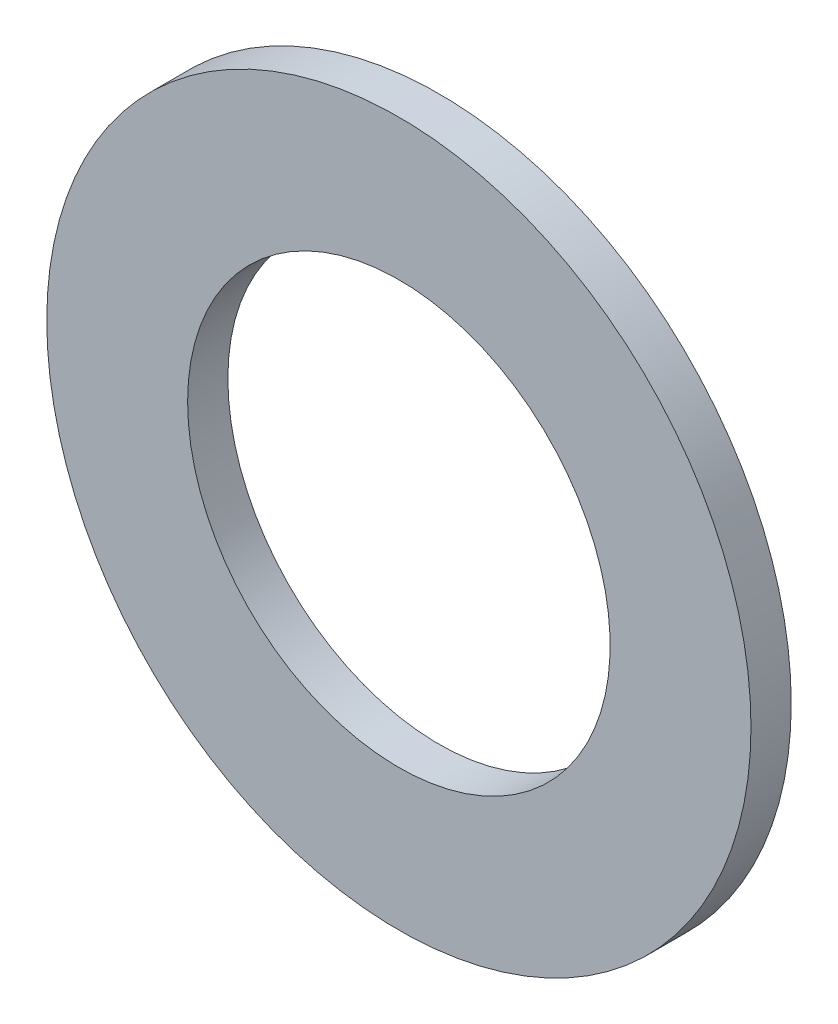
ISO-10303-21;
HEADER;
FILE_DESCRIPTION(('STEP AP214'),'2;1');
FILE_NAME('part.step','',(''),(''),'','','');
FILE_SCHEMA(('AUTOMOTIVE_DESIGN { 1 0 10303 214 1 1 1 1 }'));
ENDSEC;
DATA;
#1=APPLICATION_CONTEXT('core data for automotive mechanical design processes');
#2=APPLICATION_PROTOCOL_DEFINITION('international standard','automotive_design',2000,#1);
#3=PRODUCT_CONTEXT('',#1,'mechanical');
#4=PRODUCT('Part','Part','',(#3));
#5=PRODUCT_RELATED_PRODUCT_CATEGORY('part','',(#4));
#6=PRODUCT_DEFINITION_FORMATION('','',#4);
#7=PRODUCT_DEFINITION_CONTEXT('part definition',#1,'design');
#8=PRODUCT_DEFINITION('design','',#6,#7);
#9=PRODUCT_DEFINITION_SHAPE('','',#8);
#10=(LENGTH_UNIT() NAMED_UNIT(*) SI_UNIT(.MILLI.,.METRE.));
#11=(NAMED_UNIT(*) PLANE_ANGLE_UNIT() SI_UNIT($,.RADIAN.));
#12=(NAMED_UNIT(*) SI_UNIT($,.STERADIAN.) SOLID_ANGLE_UNIT());
#13=UNCERTAINTY_MEASURE_WITH_UNIT(LENGTH_MEASURE(1.E-05),#10,'distance_accuracy_value','');
#14=(GEOMETRIC_REPRESENTATION_CONTEXT(3) GLOBAL_UNCERTAINTY_ASSIGNED_CONTEXT((#13)) GLOBAL_UNIT_ASSIGNED_CONTEXT((#10,
#11,#12)) REPRESENTATION_CONTEXT('',''));
#15=CARTESIAN_POINT('',(0.,0.,0.));
#16=DIRECTION('',(0.,0.,1.));
#17=DIRECTION('',(1.,0.,0.));
#18=AXIS2_PLACEMENT_3D('',#15,#16,#17);
#19=CARTESIAN_POINT('',(0.,0.,1.99999999999998));
#20=DIRECTION('',(0.,0.,0.999999999999995));
#21=DIRECTION('',(0.999999999999999,0.,0.));
#22=AXIS2_PLACEMENT_3D('',#19,#20,#21);
#23=PLANE('',#22);
#24=CARTESIAN_POINT('',(0.,0.,1.99999999999998));
#25=DIRECTION('',(0.,0.,0.999999999999995));
#26=DIRECTION('',(0.999999999999999,0.,0.));
#27=AXIS2_PLACEMENT_3D('',#24,#25,#26);
#28=CIRCLE('',#27,17.5);
#29=CARTESIAN_POINT('',(-17.5,0.,1.99999999999998));
#30=VERTEX_POINT('',#29);
#31=EDGE_CURVE('E12',#30,#30,#28,.T.);
#32=ORIENTED_EDGE('',*,*,#31,.T.);
#33=EDGE_LOOP('',(#32));
#34=FACE_BOUND('',#33,.T.);
#35=CARTESIAN_POINT('',(0.,0.,1.99999999999998));
#36=DIRECTION('',(0.,0.,0.999999999999995));
#37=DIRECTION('',(0.999999999999999,0.,0.));
#38=AXIS2_PLACEMENT_3D('',#35,#36,#37);
#39=CIRCLE('',#38,10.5);
#40=CARTESIAN_POINT('',(-10.5,0.,1.99999999999998));
#41=VERTEX_POINT('',#40);
#42=EDGE_CURVE('E49',#41,#41,#39,.T.);
#43=ORIENTED_EDGE('',*,*,#42,.F.);
#44=EDGE_LOOP('',(#43));
#45=FACE_BOUND('',#44,.T.);
#46=ADVANCED_FACE('F38',(#34,#45),#23,.T.);
#47=CARTESIAN_POINT('',(0.,0.,0.));
#48=DIRECTION('',(0.,0.,0.999999999999995));
#49=DIRECTION('',(0.999999999999999,0.,0.));
#50=AXIS2_PLACEMENT_3D('',#47,#48,#49);
#51=PLANE('',#50);
#52=CARTESIAN_POINT('',(0.,0.,0.));
#53=DIRECTION('',(0.,0.,0.999999999999995));
#54=DIRECTION('',(0.999999999999999,0.,0.));
#55=AXIS2_PLACEMENT_3D('',#52,#53,#54);
#56=CIRCLE('',#55,17.5);
#57=CARTESIAN_POINT('',(-17.5,0.,0.));
#58=VERTEX_POINT('',#57);
#59=EDGE_CURVE('E42',#58,#58,#56,.T.);
#60=ORIENTED_EDGE('',*,*,#59,.F.);
#61=EDGE_LOOP('',(#60));
#62=FACE_BOUND('',#61,.T.);
#63=CARTESIAN_POINT('',(0.,0.,0.));
#64=DIRECTION('',(0.,0.,0.999999999999995));
#65=DIRECTION('',(0.999999999999999,0.,0.));
#66=AXIS2_PLACEMENT_3D('',#63,#64,#65);
#67=CIRCLE('',#66,10.5);
#68=CARTESIAN_POINT('',(-10.5,0.,0.));
#69=VERTEX_POINT('',#68);
#70=EDGE_CURVE('E51',#69,#69,#67,.T.);
#71=ORIENTED_EDGE('',*,*,#70,.T.);
#72=EDGE_LOOP('',(#71));
#73=FACE_BOUND('',#72,.T.);
#74=ADVANCED_FACE('F61',(#62,#73),#51,.F.);
#75=CARTESIAN_POINT('',(0.,0.,1.99999999999998));
#76=DIRECTION('',(0.,0.,-0.999999999999995));
#77=DIRECTION('',(-0.999999999999999,0.,0.));
#78=AXIS2_PLACEMENT_3D('',#75,#76,#77);
#79=CYLINDRICAL_SURFACE('',#78,17.5);
#80=CARTESIAN_POINT('',(-17.5,0.,1.99999999999998));
#81=CARTESIAN_POINT('',(-17.5,0.,1.97916666666665));
#82=CARTESIAN_POINT('',(-17.5,0.,1.95833333333332));
#83=CARTESIAN_POINT('',(-17.5,0.,1.91666666666665));
#84=CARTESIAN_POINT('',(-17.5,0.,1.89583333333332));
#85=CARTESIAN_POINT('',(-17.5,0.,1.85416666666665));
#86=CARTESIAN_POINT('',(-17.5,0.,1.83333333333332));
#87=CARTESIAN_POINT('',(-17.5,0.,1.79166666666665));
#88=CARTESIAN_POINT('',(-17.5,0.,1.77083333333332));
#89=CARTESIAN_POINT('',(-17.5,0.,1.72916666666665));
#90=CARTESIAN_POINT('',(-17.5,0.,1.70833333333332));
#91=CARTESIAN_POINT('',(-17.5,0.,1.66666666666665));
#92=CARTESIAN_POINT('',(-17.5,0.,1.64583333333332));
#93=CARTESIAN_POINT('',(-17.5,0.,1.60416666666665));
#94=CARTESIAN_POINT('',(-17.5,0.,1.58333333333332));
#95=CARTESIAN_POINT('',(-17.5,0.,1.54166666666665));
#96=CARTESIAN_POINT('',(-17.5,0.,1.52083333333332));
#97=CARTESIAN_POINT('',(-17.5,0.,1.47916666666665));
#98=CARTESIAN_POINT('',(-17.5,0.,1.45833333333332));
#99=CARTESIAN_POINT('',(-17.5,0.,1.41666666666665));
#100=CARTESIAN_POINT('',(-17.5,0.,1.39583333333332));
#101=CARTESIAN_POINT('',(-17.5,0.,1.35416666666665));
#102=CARTESIAN_POINT('',(-17.5,0.,1.33333333333332));
#103=CARTESIAN_POINT('',(-17.5,0.,1.29166666666665));
#104=CARTESIAN_POINT('',(-17.5,0.,1.27083333333332));
#105=CARTESIAN_POINT('',(-17.5,0.,1.22916666666666));
#106=CARTESIAN_POINT('',(-17.5,0.,1.20833333333332));
#107=CARTESIAN_POINT('',(-17.5,0.,1.16666666666666));
#108=CARTESIAN_POINT('',(-17.5,0.,1.14583333333332));
#109=CARTESIAN_POINT('',(-17.5,0.,1.10416666666666));
#110=CARTESIAN_POINT('',(-17.5,0.,1.08333333333332));
#111=CARTESIAN_POINT('',(-17.5,0.,1.04166666666666));
#112=CARTESIAN_POINT('',(-17.5,0.,1.02083333333332));
#113=CARTESIAN_POINT('',(-17.5,0.,0.979166666666658));
#114=CARTESIAN_POINT('',(-17.5,0.,0.958333333333325));
#115=CARTESIAN_POINT('',(-17.5,0.,0.916666666666658));
#116=CARTESIAN_POINT('',(-17.5,0.,0.895833333333325));
#117=CARTESIAN_POINT('',(-17.5,0.,0.854166666666659));
#118=CARTESIAN_POINT('',(-17.5,0.,0.833333333333326));
#119=CARTESIAN_POINT('',(-17.5,0.,0.79166666666666));
#120=CARTESIAN_POINT('',(-17.5,0.,0.770833333333326));
#121=CARTESIAN_POINT('',(-17.5,0.,0.72916666666666));
#122=CARTESIAN_POINT('',(-17.5,0.,0.708333333333327));
#123=CARTESIAN_POINT('',(-17.5,0.,0.666666666666661));
#124=CARTESIAN_POINT('',(-17.5,0.,0.645833333333327));
#125=CARTESIAN_POINT('',(-17.5,0.,0.604166666666661));
#126=CARTESIAN_POINT('',(-17.5,0.,0.583333333333328));
#127=CARTESIAN_POINT('',(-17.5,0.,0.541666666666662));
#128=CARTESIAN_POINT('',(-17.5,0.,0.520833333333329));
#129=CARTESIAN_POINT('',(-17.5,0.,0.479166666666662));
#130=CARTESIAN_POINT('',(-17.5,0.,0.458333333333329));
#131=CARTESIAN_POINT('',(-17.5,0.,0.416666666666663));
#132=CARTESIAN_POINT('',(-17.5,0.,0.39583333333333));
#133=CARTESIAN_POINT('',(-17.5,0.,0.354166666666663));
#134=CARTESIAN_POINT('',(-17.5,0.,0.33333333333333));
#135=CARTESIAN_POINT('',(-17.5,0.,0.291666666666664));
#136=CARTESIAN_POINT('',(-17.5,0.,0.270833333333331));
#137=CARTESIAN_POINT('',(-17.5,0.,0.229166666666665));
#138=CARTESIAN_POINT('',(-17.5,0.,0.208333333333331));
#139=CARTESIAN_POINT('',(-17.5,0.,0.166666666666665));
#140=CARTESIAN_POINT('',(-17.5,0.,0.145833333333332));
#141=CARTESIAN_POINT('',(-17.5,0.,0.104166666666666));
#142=CARTESIAN_POINT('',(-17.5,0.,0.0833333333333325));
#143=CARTESIAN_POINT('',(-17.5,0.,0.0416666666666663));
#144=CARTESIAN_POINT('',(-17.5,0.,0.0208333333333331));
#145=CARTESIAN_POINT('',(-17.5,0.,0.));
#146=B_SPLINE_CURVE_WITH_KNOTS('',3,(#80,#81,#82,#83,#84,#85,#86,#87,#88,#89,#90,#91,#92,#93,
#94,#95,#96,#97,#98,#99,#100,#101,#102,#103,#104,#105,#106,#107,#108,#109,#110,#111,#112,#113,
#114,#115,#116,#117,#118,#119,#120,#121,#122,#123,#124,#125,#126,#127,#128,#129,#130,#131,#132,
#133,#134,#135,#136,#137,#138,#139,#140,#141,#142,#143,#144,#145),.UNSPECIFIED.,.F.,.F.,(4,2,2,
2,2,2,2,2,2,2,2,2,2,2,2,2,2,2,2,2,2,2,2,2,2,2,2,2,2,2,2,2,4),(0.,0.0624999999999992,
0.124999999999999,0.187499999999998,0.249999999999997,0.312499999999997,0.374999999999996,
0.437499999999996,0.499999999999995,0.562499999999995,0.624999999999994,0.687499999999993,
0.749999999999993,0.812499999999992,0.874999999999992,0.937499999999991,0.99999999999999,
1.06249999999999,1.12499999999999,1.18749999999999,1.24999999999999,1.31249999999999,
1.37499999999999,1.43749999999999,1.49999999999999,1.56249999999999,1.62499999999998,
1.68749999999998,1.74999999999998,1.81249999999998,1.87499999999998,1.93749999999998,
1.99999999999998),.UNSPECIFIED.);
#147=EDGE_CURVE('BSEAM40',#30,#58,#146,.T.);
#148=ORIENTED_EDGE('',*,*,#31,.F.);
#149=ORIENTED_EDGE('',*,*,#59,.T.);
#150=ORIENTED_EDGE('',*,*,#147,.T.);
#151=ORIENTED_EDGE('',*,*,#147,.F.);
#152=EDGE_LOOP('',(#148,#150,#149,#151));
#153=FACE_BOUND('',#152,.T.);
#154=ADVANCED_FACE('F40',(#153),#79,.T.);
#155=CARTESIAN_POINT('',(0.,0.,1.99999999999998));
#156=DIRECTION('',(0.,0.,-0.999999999999995));
#157=DIRECTION('',(-0.999999999999999,0.,0.));
#158=AXIS2_PLACEMENT_3D('',#155,#156,#157);
#159=CYLINDRICAL_SURFACE('',#158,10.5);
#160=CARTESIAN_POINT('',(-10.5,0.,1.99999999999998));
#161=CARTESIAN_POINT('',(-10.5,0.,1.97916666666665));
#162=CARTESIAN_POINT('',(-10.5,0.,1.95833333333332));
#163=CARTESIAN_POINT('',(-10.5,0.,1.91666666666665));
#164=CARTESIAN_POINT('',(-10.5,0.,1.89583333333332));
#165=CARTESIAN_POINT('',(-10.5,0.,1.85416666666665));
#166=CARTESIAN_POINT('',(-10.5,0.,1.83333333333332));
#167=CARTESIAN_POINT('',(-10.5,0.,1.79166666666665));
#168=CARTESIAN_POINT('',(-10.5,0.,1.77083333333332));
#169=CARTESIAN_POINT('',(-10.5,0.,1.72916666666665));
#170=CARTESIAN_POINT('',(-10.5,0.,1.70833333333332));
#171=CARTESIAN_POINT('',(-10.5,0.,1.66666666666665));
#172=CARTESIAN_POINT('',(-10.5,0.,1.64583333333332));
#173=CARTESIAN_POINT('',(-10.5,0.,1.60416666666665));
#174=CARTESIAN_POINT('',(-10.5,0.,1.58333333333332));
#175=CARTESIAN_POINT('',(-10.5,0.,1.54166666666665));
#176=CARTESIAN_POINT('',(-10.5,0.,1.52083333333332));
#177=CARTESIAN_POINT('',(-10.5,0.,1.47916666666665));
#178=CARTESIAN_POINT('',(-10.5,0.,1.45833333333332));
#179=CARTESIAN_POINT('',(-10.5,0.,1.41666666666665));
#180=CARTESIAN_POINT('',(-10.5,0.,1.39583333333332));
#181=CARTESIAN_POINT('',(-10.5,0.,1.35416666666665));
#182=CARTESIAN_POINT('',(-10.5,0.,1.33333333333332));
#183=CARTESIAN_POINT('',(-10.5,0.,1.29166666666665));
#184=CARTESIAN_POINT('',(-10.5,0.,1.27083333333332));
#185=CARTESIAN_POINT('',(-10.5,0.,1.22916666666666));
#186=CARTESIAN_POINT('',(-10.5,0.,1.20833333333332));
#187=CARTESIAN_POINT('',(-10.5,0.,1.16666666666666));
#188=CARTESIAN_POINT('',(-10.5,0.,1.14583333333332));
#189=CARTESIAN_POINT('',(-10.5,0.,1.10416666666666));
#190=CARTESIAN_POINT('',(-10.5,0.,1.08333333333332));
#191=CARTESIAN_POINT('',(-10.5,0.,1.04166666666666));
#192=CARTESIAN_POINT('',(-10.5,0.,1.02083333333332));
#193=CARTESIAN_POINT('',(-10.5,0.,0.979166666666658));
#194=CARTESIAN_POINT('',(-10.5,0.,0.958333333333325));
#195=CARTESIAN_POINT('',(-10.5,0.,0.916666666666658));
#196=CARTESIAN_POINT('',(-10.5,0.,0.895833333333325));
#197=CARTESIAN_POINT('',(-10.5,0.,0.854166666666659));
#198=CARTESIAN_POINT('',(-10.5,0.,0.833333333333326));
#199=CARTESIAN_POINT('',(-10.5,0.,0.79166666666666));
#200=CARTESIAN_POINT('',(-10.5,0.,0.770833333333326));
#201=CARTESIAN_POINT('',(-10.5,0.,0.72916666666666));
#202=CARTESIAN_POINT('',(-10.5,0.,0.708333333333327));
#203=CARTESIAN_POINT('',(-10.5,0.,0.666666666666661));
#204=CARTESIAN_POINT('',(-10.5,0.,0.645833333333327));
#205=CARTESIAN_POINT('',(-10.5,0.,0.604166666666661));
#206=CARTESIAN_POINT('',(-10.5,0.,0.583333333333328));
#207=CARTESIAN_POINT('',(-10.5,0.,0.541666666666662));
#208=CARTESIAN_POINT('',(-10.5,0.,0.520833333333329));
#209=CARTESIAN_POINT('',(-10.5,0.,0.479166666666662));
#210=CARTESIAN_POINT('',(-10.5,0.,0.458333333333329));
#211=CARTESIAN_POINT('',(-10.5,0.,0.416666666666663));
#212=CARTESIAN_POINT('',(-10.5,0.,0.39583333333333));
#213=CARTESIAN_POINT('',(-10.5,0.,0.354166666666663));
#214=CARTESIAN_POINT('',(-10.5,0.,0.33333333333333));
#215=CARTESIAN_POINT('',(-10.5,0.,0.291666666666664));
#216=CARTESIAN_POINT('',(-10.5,0.,0.270833333333331));
#217=CARTESIAN_POINT('',(-10.5,0.,0.229166666666665));
#218=CARTESIAN_POINT('',(-10.5,0.,0.208333333333331));
#219=CARTESIAN_POINT('',(-10.5,0.,0.166666666666665));
#220=CARTESIAN_POINT('',(-10.5,0.,0.145833333333332));
#221=CARTESIAN_POINT('',(-10.5,0.,0.104166666666666));
#222=CARTESIAN_POINT('',(-10.5,0.,0.0833333333333325));
#223=CARTESIAN_POINT('',(-10.5,0.,0.0416666666666663));
#224=CARTESIAN_POINT('',(-10.5,0.,0.0208333333333331));
#225=CARTESIAN_POINT('',(-10.5,0.,0.));
#226=B_SPLINE_CURVE_WITH_KNOTS('',3,(#160,#161,#162,#163,#164,#165,#166,#167,#168,#169,#170,
#171,#172,#173,#174,#175,#176,#177,#178,#179,#180,#181,#182,#183,#184,#185,#186,#187,#188,#189,
#190,#191,#192,#193,#194,#195,#196,#197,#198,#199,#200,#201,#202,#203,#204,#205,#206,#207,#208,
#209,#210,#211,#212,#213,#214,#215,#216,#217,#218,#219,#220,#221,#222,#223,#224,#225),
.UNSPECIFIED.,.F.,.F.,(4,2,2,2,2,2,2,2,2,2,2,2,2,2,2,2,2,2,2,2,2,2,2,2,2,2,2,2,2,2,2,2,4),(0.,
0.0624999999999992,0.124999999999999,0.187499999999998,0.249999999999997,0.312499999999997,
0.374999999999996,0.437499999999996,0.499999999999995,0.562499999999995,0.624999999999994,
0.687499999999993,0.749999999999993,0.812499999999992,0.874999999999992,0.937499999999991,
0.99999999999999,1.06249999999999,1.12499999999999,1.18749999999999,1.24999999999999,
1.31249999999999,1.37499999999999,1.43749999999999,1.49999999999999,1.56249999999999,
1.62499999999998,1.68749999999998,1.74999999999998,1.81249999999998,1.87499999999998,
1.93749999999998,1.99999999999998),.UNSPECIFIED.);
#227=EDGE_CURVE('BSEAM57',#41,#69,#226,.T.);
#228=ORIENTED_EDGE('',*,*,#42,.T.);
#229=ORIENTED_EDGE('',*,*,#70,.F.);
#230=ORIENTED_EDGE('',*,*,#227,.T.);
#231=ORIENTED_EDGE('',*,*,#227,.F.);
#232=EDGE_LOOP('',(#228,#230,#229,#231));
#233=FACE_BOUND('',#232,.T.);
#234=ADVANCED_FACE('F57',(#233),#159,.F.);
#235=CLOSED_SHELL('',(#46,#74,#154,#234));
#236=MANIFOLD_SOLID_BREP('B2',#235);
#237=ADVANCED_BREP_SHAPE_REPRESENTATION('',(#18,#236),#14);
#238=SHAPE_DEFINITION_REPRESENTATION(#9,#237);
ENDSEC;
END-ISO-10303-21;
